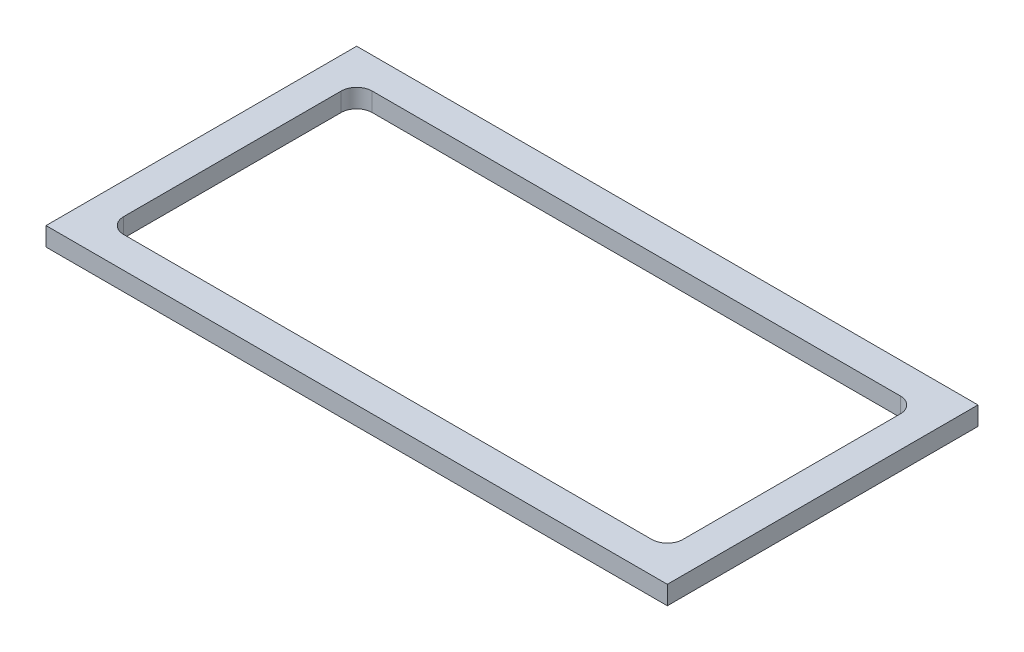
ISO-10303-21;
HEADER;
FILE_DESCRIPTION(('STEP AP214'),'2;1');
FILE_NAME('part.step','',(''),(''),'','','');
FILE_SCHEMA(('AUTOMOTIVE_DESIGN { 1 0 10303 214 1 1 1 1 }'));
ENDSEC;
DATA;
#1=APPLICATION_CONTEXT('core data for automotive mechanical design processes');
#2=APPLICATION_PROTOCOL_DEFINITION('international standard','automotive_design',2000,#1);
#3=PRODUCT_CONTEXT('',#1,'mechanical');
#4=PRODUCT('Part','Part','',(#3));
#5=PRODUCT_RELATED_PRODUCT_CATEGORY('part','',(#4));
#6=PRODUCT_DEFINITION_FORMATION('','',#4);
#7=PRODUCT_DEFINITION_CONTEXT('part definition',#1,'design');
#8=PRODUCT_DEFINITION('design','',#6,#7);
#9=PRODUCT_DEFINITION_SHAPE('','',#8);
#10=(LENGTH_UNIT() NAMED_UNIT(*) SI_UNIT(.MILLI.,.METRE.));
#11=(NAMED_UNIT(*) PLANE_ANGLE_UNIT() SI_UNIT($,.RADIAN.));
#12=(NAMED_UNIT(*) SI_UNIT($,.STERADIAN.) SOLID_ANGLE_UNIT());
#13=UNCERTAINTY_MEASURE_WITH_UNIT(LENGTH_MEASURE(1.E-05),#10,'distance_accuracy_value','');
#14=(GEOMETRIC_REPRESENTATION_CONTEXT(3) GLOBAL_UNCERTAINTY_ASSIGNED_CONTEXT((#13)) GLOBAL_UNIT_ASSIGNED_CONTEXT((#10,
#11,#12)) REPRESENTATION_CONTEXT('',''));
#15=CARTESIAN_POINT('',(0.,0.,0.));
#16=DIRECTION('',(0.,0.,1.));
#17=DIRECTION('',(1.,0.,0.));
#18=AXIS2_PLACEMENT_3D('',#15,#16,#17);
#19=CARTESIAN_POINT('',(0.,6.,0.));
#20=DIRECTION('',(1.,0.,0.));
#21=DIRECTION('',(0.,0.,-1.));
#22=AXIS2_PLACEMENT_3D('',#19,#20,#21);
#23=PLANE('',#22);
#24=DIRECTION('',(0.,0.,1.));
#25=VECTOR('',#24,1.);
#26=CARTESIAN_POINT('',(0.,0.,0.));
#27=LINE('',#26,#25);
#28=CARTESIAN_POINT('',(0.,0.,-100.));
#29=VERTEX_POINT('',#28);
#30=CARTESIAN_POINT('',(0.,0.,0.));
#31=VERTEX_POINT('',#30);
#32=EDGE_CURVE('E145',#29,#31,#27,.T.);
#33=ORIENTED_EDGE('',*,*,#32,.T.);
#34=DIRECTION('',(0.,-1.,0.));
#35=VECTOR('',#34,1.);
#36=CARTESIAN_POINT('',(0.,6.,0.));
#37=LINE('',#36,#35);
#38=CARTESIAN_POINT('',(0.,6.,0.));
#39=VERTEX_POINT('',#38);
#40=EDGE_CURVE('E126',#39,#31,#37,.T.);
#41=ORIENTED_EDGE('',*,*,#40,.F.);
#42=DIRECTION('',(0.,0.,1.));
#43=VECTOR('',#42,1.);
#44=CARTESIAN_POINT('',(0.,6.,0.));
#45=LINE('',#44,#43);
#46=CARTESIAN_POINT('',(0.,6.,-100.));
#47=VERTEX_POINT('',#46);
#48=EDGE_CURVE('E133',#47,#39,#45,.T.);
#49=ORIENTED_EDGE('',*,*,#48,.F.);
#50=DIRECTION('',(0.,-1.,0.));
#51=VECTOR('',#50,1.);
#52=CARTESIAN_POINT('',(0.,6.,-100.));
#53=LINE('',#52,#51);
#54=EDGE_CURVE('E220',#47,#29,#53,.T.);
#55=ORIENTED_EDGE('',*,*,#54,.T.);
#56=EDGE_LOOP('',(#33,#41,#49,#55));
#57=FACE_BOUND('',#56,.T.);
#58=ADVANCED_FACE('F32',(#57),#23,.F.);
#59=CARTESIAN_POINT('',(0.,6.,0.));
#60=DIRECTION('',(0.,0.,-1.));
#61=DIRECTION('',(-1.,0.,0.));
#62=AXIS2_PLACEMENT_3D('',#59,#60,#61);
#63=PLANE('',#62);
#64=DIRECTION('',(1.,0.,0.));
#65=VECTOR('',#64,1.);
#66=CARTESIAN_POINT('',(0.,0.,0.));
#67=LINE('',#66,#65);
#68=CARTESIAN_POINT('',(200.,0.,0.));
#69=VERTEX_POINT('',#68);
#70=EDGE_CURVE('E222',#31,#69,#67,.T.);
#71=ORIENTED_EDGE('',*,*,#70,.T.);
#72=DIRECTION('',(0.,-1.,0.));
#73=VECTOR('',#72,1.);
#74=CARTESIAN_POINT('',(200.,6.,0.));
#75=LINE('',#74,#73);
#76=CARTESIAN_POINT('',(200.,6.,0.));
#77=VERTEX_POINT('',#76);
#78=EDGE_CURVE('E129',#77,#69,#75,.T.);
#79=ORIENTED_EDGE('',*,*,#78,.F.);
#80=DIRECTION('',(1.,0.,0.));
#81=VECTOR('',#80,1.);
#82=CARTESIAN_POINT('',(0.,6.,0.));
#83=LINE('',#82,#81);
#84=EDGE_CURVE('E122',#39,#77,#83,.T.);
#85=ORIENTED_EDGE('',*,*,#84,.F.);
#86=ORIENTED_EDGE('',*,*,#40,.T.);
#87=EDGE_LOOP('',(#71,#79,#85,#86));
#88=FACE_BOUND('',#87,.T.);
#89=ADVANCED_FACE('F124',(#88),#63,.F.);
#90=CARTESIAN_POINT('',(200.,6.,0.));
#91=DIRECTION('',(-1.,0.,0.));
#92=DIRECTION('',(0.,0.,1.));
#93=AXIS2_PLACEMENT_3D('',#90,#91,#92);
#94=PLANE('',#93);
#95=DIRECTION('',(0.,0.,-1.));
#96=VECTOR('',#95,1.);
#97=CARTESIAN_POINT('',(200.,0.,0.));
#98=LINE('',#97,#96);
#99=CARTESIAN_POINT('',(200.,0.,-100.));
#100=VERTEX_POINT('',#99);
#101=EDGE_CURVE('E224',#69,#100,#98,.T.);
#102=ORIENTED_EDGE('',*,*,#101,.T.);
#103=DIRECTION('',(0.,-1.,0.));
#104=VECTOR('',#103,1.);
#105=CARTESIAN_POINT('',(200.,6.,-100.));
#106=LINE('',#105,#104);
#107=CARTESIAN_POINT('',(200.,6.,-100.));
#108=VERTEX_POINT('',#107);
#109=EDGE_CURVE('E150',#108,#100,#106,.T.);
#110=ORIENTED_EDGE('',*,*,#109,.F.);
#111=DIRECTION('',(0.,0.,-1.));
#112=VECTOR('',#111,1.);
#113=CARTESIAN_POINT('',(200.,6.,0.));
#114=LINE('',#113,#112);
#115=EDGE_CURVE('E132',#77,#108,#114,.T.);
#116=ORIENTED_EDGE('',*,*,#115,.F.);
#117=ORIENTED_EDGE('',*,*,#78,.T.);
#118=EDGE_LOOP('',(#102,#110,#116,#117));
#119=FACE_BOUND('',#118,.T.);
#120=ADVANCED_FACE('F234',(#119),#94,.F.);
#121=CARTESIAN_POINT('',(0.,6.,-100.));
#122=DIRECTION('',(0.,0.,1.));
#123=DIRECTION('',(1.,0.,0.));
#124=AXIS2_PLACEMENT_3D('',#121,#122,#123);
#125=PLANE('',#124);
#126=DIRECTION('',(-1.,0.,0.));
#127=VECTOR('',#126,1.);
#128=CARTESIAN_POINT('',(0.,0.,-100.));
#129=LINE('',#128,#127);
#130=EDGE_CURVE('E142',#100,#29,#129,.T.);
#131=ORIENTED_EDGE('',*,*,#130,.T.);
#132=ORIENTED_EDGE('',*,*,#54,.F.);
#133=DIRECTION('',(-1.,0.,0.));
#134=VECTOR('',#133,1.);
#135=CARTESIAN_POINT('',(0.,6.,-100.));
#136=LINE('',#135,#134);
#137=EDGE_CURVE('E138',#108,#47,#136,.T.);
#138=ORIENTED_EDGE('',*,*,#137,.F.);
#139=ORIENTED_EDGE('',*,*,#109,.T.);
#140=EDGE_LOOP('',(#131,#132,#138,#139));
#141=FACE_BOUND('',#140,.T.);
#142=ADVANCED_FACE('F231',(#141),#125,.F.);
#143=CARTESIAN_POINT('',(0.,6.,0.));
#144=DIRECTION('',(0.,-1.,0.));
#145=DIRECTION('',(0.,0.,-1.));
#146=AXIS2_PLACEMENT_3D('',#143,#144,#145);
#147=PLANE('',#146);
#148=DIRECTION('',(1.,0.,0.));
#149=VECTOR('',#148,1.);
#150=CARTESIAN_POINT('',(10.,6.,-10.));
#151=LINE('',#150,#149);
#152=CARTESIAN_POINT('',(15.,6.,-10.));
#153=VERTEX_POINT('',#152);
#154=CARTESIAN_POINT('',(185.,6.,-10.));
#155=VERTEX_POINT('',#154);
#156=EDGE_CURVE('E213',#153,#155,#151,.T.);
#157=ORIENTED_EDGE('',*,*,#156,.F.);
#158=CARTESIAN_POINT('',(15.,6.,-15.));
#159=DIRECTION('',(0.,-1.,0.));
#160=DIRECTION('',(0.,0.,-1.));
#161=AXIS2_PLACEMENT_3D('',#158,#159,#160);
#162=CIRCLE('',#161,5.);
#163=CARTESIAN_POINT('',(10.,6.,-15.));
#164=VERTEX_POINT('',#163);
#165=EDGE_CURVE('E170',#153,#164,#162,.T.);
#166=ORIENTED_EDGE('',*,*,#165,.T.);
#167=DIRECTION('',(0.,0.,1.));
#168=VECTOR('',#167,1.);
#169=CARTESIAN_POINT('',(10.,6.,-90.));
#170=LINE('',#169,#168);
#171=CARTESIAN_POINT('',(10.,6.,-85.));
#172=VERTEX_POINT('',#171);
#173=EDGE_CURVE('E186',#172,#164,#170,.T.);
#174=ORIENTED_EDGE('',*,*,#173,.F.);
#175=CARTESIAN_POINT('',(15.,6.,-85.));
#176=DIRECTION('',(0.,-1.,0.));
#177=DIRECTION('',(0.,0.,-1.));
#178=AXIS2_PLACEMENT_3D('',#175,#176,#177);
#179=CIRCLE('',#178,5.);
#180=CARTESIAN_POINT('',(15.,6.,-90.));
#181=VERTEX_POINT('',#180);
#182=EDGE_CURVE('E40',#172,#181,#179,.T.);
#183=ORIENTED_EDGE('',*,*,#182,.T.);
#184=DIRECTION('',(-1.,0.,0.));
#185=VECTOR('',#184,1.);
#186=CARTESIAN_POINT('',(10.,6.,-90.));
#187=LINE('',#186,#185);
#188=CARTESIAN_POINT('',(185.,6.,-90.));
#189=VERTEX_POINT('',#188);
#190=EDGE_CURVE('E184',#189,#181,#187,.T.);
#191=ORIENTED_EDGE('',*,*,#190,.F.);
#192=CARTESIAN_POINT('',(185.,6.,-85.));
#193=DIRECTION('',(0.,-1.,0.));
#194=DIRECTION('',(0.,0.,-1.));
#195=AXIS2_PLACEMENT_3D('',#192,#193,#194);
#196=CIRCLE('',#195,5.);
#197=CARTESIAN_POINT('',(190.,6.,-85.));
#198=VERTEX_POINT('',#197);
#199=EDGE_CURVE('E178',#189,#198,#196,.T.);
#200=ORIENTED_EDGE('',*,*,#199,.T.);
#201=DIRECTION('',(0.,0.,-1.));
#202=VECTOR('',#201,1.);
#203=CARTESIAN_POINT('',(190.,6.,-90.));
#204=LINE('',#203,#202);
#205=CARTESIAN_POINT('',(190.,6.,-15.));
#206=VERTEX_POINT('',#205);
#207=EDGE_CURVE('E192',#206,#198,#204,.T.);
#208=ORIENTED_EDGE('',*,*,#207,.F.);
#209=CARTESIAN_POINT('',(185.,6.,-15.));
#210=DIRECTION('',(0.,-1.,0.));
#211=DIRECTION('',(0.,0.,-1.));
#212=AXIS2_PLACEMENT_3D('',#209,#210,#211);
#213=CIRCLE('',#212,5.);
#214=EDGE_CURVE('E174',#206,#155,#213,.T.);
#215=ORIENTED_EDGE('',*,*,#214,.T.);
#216=EDGE_LOOP('',(#157,#166,#174,#183,#191,#200,#208,#215));
#217=FACE_BOUND('',#216,.T.);
#218=ORIENTED_EDGE('',*,*,#48,.T.);
#219=ORIENTED_EDGE('',*,*,#84,.T.);
#220=ORIENTED_EDGE('',*,*,#115,.T.);
#221=ORIENTED_EDGE('',*,*,#137,.T.);
#222=EDGE_LOOP('',(#218,#219,#220,#221));
#223=FACE_BOUND('',#222,.T.);
#224=ADVANCED_FACE('F136',(#217,#223),#147,.F.);
#225=CARTESIAN_POINT('',(0.,0.,0.));
#226=DIRECTION('',(0.,-1.,0.));
#227=DIRECTION('',(0.,0.,-1.));
#228=AXIS2_PLACEMENT_3D('',#225,#226,#227);
#229=PLANE('',#228);
#230=DIRECTION('',(-1.,0.,0.));
#231=VECTOR('',#230,1.);
#232=CARTESIAN_POINT('',(10.,0.,-90.));
#233=LINE('',#232,#231);
#234=CARTESIAN_POINT('',(185.,0.,-90.));
#235=VERTEX_POINT('',#234);
#236=CARTESIAN_POINT('',(15.,0.,-90.));
#237=VERTEX_POINT('',#236);
#238=EDGE_CURVE('E200',#235,#237,#233,.T.);
#239=ORIENTED_EDGE('',*,*,#238,.T.);
#240=CARTESIAN_POINT('',(15.,0.,-85.));
#241=DIRECTION('',(0.,-1.,0.));
#242=DIRECTION('',(0.,0.,-1.));
#243=AXIS2_PLACEMENT_3D('',#240,#241,#242);
#244=CIRCLE('',#243,5.);
#245=CARTESIAN_POINT('',(10.,0.,-85.));
#246=VERTEX_POINT('',#245);
#247=EDGE_CURVE('E11',#237,#246,#244,.F.);
#248=ORIENTED_EDGE('',*,*,#247,.T.);
#249=DIRECTION('',(0.,0.,1.));
#250=VECTOR('',#249,1.);
#251=CARTESIAN_POINT('',(10.,0.,-90.));
#252=LINE('',#251,#250);
#253=CARTESIAN_POINT('',(10.,0.,-15.));
#254=VERTEX_POINT('',#253);
#255=EDGE_CURVE('E191',#246,#254,#252,.T.);
#256=ORIENTED_EDGE('',*,*,#255,.T.);
#257=CARTESIAN_POINT('',(15.,0.,-15.));
#258=DIRECTION('',(0.,-1.,0.));
#259=DIRECTION('',(0.,0.,-1.));
#260=AXIS2_PLACEMENT_3D('',#257,#258,#259);
#261=CIRCLE('',#260,5.);
#262=CARTESIAN_POINT('',(15.,0.,-10.));
#263=VERTEX_POINT('',#262);
#264=EDGE_CURVE('E172',#254,#263,#261,.F.);
#265=ORIENTED_EDGE('',*,*,#264,.T.);
#266=DIRECTION('',(1.,0.,0.));
#267=VECTOR('',#266,1.);
#268=CARTESIAN_POINT('',(10.,0.,-10.));
#269=LINE('',#268,#267);
#270=CARTESIAN_POINT('',(185.,0.,-10.));
#271=VERTEX_POINT('',#270);
#272=EDGE_CURVE('E204',#263,#271,#269,.T.);
#273=ORIENTED_EDGE('',*,*,#272,.T.);
#274=CARTESIAN_POINT('',(185.,0.,-15.));
#275=DIRECTION('',(0.,-1.,0.));
#276=DIRECTION('',(0.,0.,-1.));
#277=AXIS2_PLACEMENT_3D('',#274,#275,#276);
#278=CIRCLE('',#277,5.);
#279=CARTESIAN_POINT('',(190.,0.,-15.));
#280=VERTEX_POINT('',#279);
#281=EDGE_CURVE('E176',#271,#280,#278,.F.);
#282=ORIENTED_EDGE('',*,*,#281,.T.);
#283=DIRECTION('',(0.,0.,-1.));
#284=VECTOR('',#283,1.);
#285=CARTESIAN_POINT('',(190.,0.,-90.));
#286=LINE('',#285,#284);
#287=CARTESIAN_POINT('',(190.,0.,-85.));
#288=VERTEX_POINT('',#287);
#289=EDGE_CURVE('E207',#280,#288,#286,.T.);
#290=ORIENTED_EDGE('',*,*,#289,.T.);
#291=CARTESIAN_POINT('',(185.,0.,-85.));
#292=DIRECTION('',(0.,-1.,0.));
#293=DIRECTION('',(0.,0.,-1.));
#294=AXIS2_PLACEMENT_3D('',#291,#292,#293);
#295=CIRCLE('',#294,5.);
#296=EDGE_CURVE('E54',#288,#235,#295,.F.);
#297=ORIENTED_EDGE('',*,*,#296,.T.);
#298=EDGE_LOOP('',(#239,#248,#256,#265,#273,#282,#290,#297));
#299=FACE_BOUND('',#298,.T.);
#300=ORIENTED_EDGE('',*,*,#32,.F.);
#301=ORIENTED_EDGE('',*,*,#130,.F.);
#302=ORIENTED_EDGE('',*,*,#101,.F.);
#303=ORIENTED_EDGE('',*,*,#70,.F.);
#304=EDGE_LOOP('',(#300,#301,#302,#303));
#305=FACE_BOUND('',#304,.T.);
#306=ADVANCED_FACE('F197',(#299,#305),#229,.T.);
#307=CARTESIAN_POINT('',(10.,0.,-90.));
#308=DIRECTION('',(-1.,0.,0.));
#309=DIRECTION('',(0.,0.,1.));
#310=AXIS2_PLACEMENT_3D('',#307,#308,#309);
#311=PLANE('',#310);
#312=ORIENTED_EDGE('',*,*,#173,.T.);
#313=DIRECTION('',(0.,1.,0.));
#314=VECTOR('',#313,1.);
#315=CARTESIAN_POINT('',(10.,0.,-15.));
#316=LINE('',#315,#314);
#317=EDGE_CURVE('E159',#164,#254,#316,.F.);
#318=ORIENTED_EDGE('',*,*,#317,.T.);
#319=ORIENTED_EDGE('',*,*,#255,.F.);
#320=DIRECTION('',(0.,1.,0.));
#321=VECTOR('',#320,1.);
#322=CARTESIAN_POINT('',(10.,6.,-85.));
#323=LINE('',#322,#321);
#324=EDGE_CURVE('E156',#246,#172,#323,.T.);
#325=ORIENTED_EDGE('',*,*,#324,.T.);
#326=EDGE_LOOP('',(#312,#318,#319,#325));
#327=FACE_BOUND('',#326,.T.);
#328=ADVANCED_FACE('F202',(#327),#311,.F.);
#329=CARTESIAN_POINT('',(10.,0.,-90.));
#330=DIRECTION('',(0.,0.,-1.));
#331=DIRECTION('',(-1.,0.,0.));
#332=AXIS2_PLACEMENT_3D('',#329,#330,#331);
#333=PLANE('',#332);
#334=ORIENTED_EDGE('',*,*,#238,.F.);
#335=DIRECTION('',(0.,1.,0.));
#336=VECTOR('',#335,1.);
#337=CARTESIAN_POINT('',(185.,6.,-90.));
#338=LINE('',#337,#336);
#339=EDGE_CURVE('E167',#235,#189,#338,.T.);
#340=ORIENTED_EDGE('',*,*,#339,.T.);
#341=ORIENTED_EDGE('',*,*,#190,.T.);
#342=DIRECTION('',(0.,1.,0.));
#343=VECTOR('',#342,1.);
#344=CARTESIAN_POINT('',(15.,0.,-90.));
#345=LINE('',#344,#343);
#346=EDGE_CURVE('E47',#181,#237,#345,.F.);
#347=ORIENTED_EDGE('',*,*,#346,.T.);
#348=EDGE_LOOP('',(#334,#340,#341,#347));
#349=FACE_BOUND('',#348,.T.);
#350=ADVANCED_FACE('F189',(#349),#333,.F.);
#351=CARTESIAN_POINT('',(190.,0.,-90.));
#352=DIRECTION('',(1.,0.,0.));
#353=DIRECTION('',(0.,0.,-1.));
#354=AXIS2_PLACEMENT_3D('',#351,#352,#353);
#355=PLANE('',#354);
#356=ORIENTED_EDGE('',*,*,#289,.F.);
#357=DIRECTION('',(0.,1.,0.));
#358=VECTOR('',#357,1.);
#359=CARTESIAN_POINT('',(190.,6.,-15.));
#360=LINE('',#359,#358);
#361=EDGE_CURVE('E163',#280,#206,#360,.T.);
#362=ORIENTED_EDGE('',*,*,#361,.T.);
#363=ORIENTED_EDGE('',*,*,#207,.T.);
#364=DIRECTION('',(0.,1.,0.));
#365=VECTOR('',#364,1.);
#366=CARTESIAN_POINT('',(190.,0.,-85.));
#367=LINE('',#366,#365);
#368=EDGE_CURVE('E161',#198,#288,#367,.F.);
#369=ORIENTED_EDGE('',*,*,#368,.T.);
#370=EDGE_LOOP('',(#356,#362,#363,#369));
#371=FACE_BOUND('',#370,.T.);
#372=ADVANCED_FACE('F266',(#371),#355,.F.);
#373=CARTESIAN_POINT('',(10.,0.,-10.));
#374=DIRECTION('',(0.,0.,1.));
#375=DIRECTION('',(1.,0.,0.));
#376=AXIS2_PLACEMENT_3D('',#373,#374,#375);
#377=PLANE('',#376);
#378=ORIENTED_EDGE('',*,*,#272,.F.);
#379=DIRECTION('',(0.,1.,0.));
#380=VECTOR('',#379,1.);
#381=CARTESIAN_POINT('',(15.,6.,-10.));
#382=LINE('',#381,#380);
#383=EDGE_CURVE('E148',#263,#153,#382,.T.);
#384=ORIENTED_EDGE('',*,*,#383,.T.);
#385=ORIENTED_EDGE('',*,*,#156,.T.);
#386=DIRECTION('',(0.,1.,0.));
#387=VECTOR('',#386,1.);
#388=CARTESIAN_POINT('',(185.,0.,-10.));
#389=LINE('',#388,#387);
#390=EDGE_CURVE('E146',#155,#271,#389,.F.);
#391=ORIENTED_EDGE('',*,*,#390,.T.);
#392=EDGE_LOOP('',(#378,#384,#385,#391));
#393=FACE_BOUND('',#392,.T.);
#394=ADVANCED_FACE('F252',(#393),#377,.F.);
#395=CARTESIAN_POINT('',(15.,0.,-15.));
#396=DIRECTION('',(0.,-1.,0.));
#397=DIRECTION('',(0.,0.,-1.));
#398=AXIS2_PLACEMENT_3D('',#395,#396,#397);
#399=CYLINDRICAL_SURFACE('',#398,5.);
#400=ORIENTED_EDGE('',*,*,#264,.F.);
#401=ORIENTED_EDGE('',*,*,#317,.F.);
#402=ORIENTED_EDGE('',*,*,#165,.F.);
#403=ORIENTED_EDGE('',*,*,#383,.F.);
#404=EDGE_LOOP('',(#400,#401,#402,#403));
#405=FACE_BOUND('',#404,.T.);
#406=ADVANCED_FACE('F248',(#405),#399,.F.);
#407=CARTESIAN_POINT('',(185.,0.,-15.));
#408=DIRECTION('',(0.,-1.,0.));
#409=DIRECTION('',(0.,0.,-1.));
#410=AXIS2_PLACEMENT_3D('',#407,#408,#409);
#411=CYLINDRICAL_SURFACE('',#410,5.);
#412=ORIENTED_EDGE('',*,*,#281,.F.);
#413=ORIENTED_EDGE('',*,*,#390,.F.);
#414=ORIENTED_EDGE('',*,*,#214,.F.);
#415=ORIENTED_EDGE('',*,*,#361,.F.);
#416=EDGE_LOOP('',(#412,#413,#414,#415));
#417=FACE_BOUND('',#416,.T.);
#418=ADVANCED_FACE('F251',(#417),#411,.F.);
#419=CARTESIAN_POINT('',(185.,0.,-85.));
#420=DIRECTION('',(0.,-1.,0.));
#421=DIRECTION('',(0.,0.,-1.));
#422=AXIS2_PLACEMENT_3D('',#419,#420,#421);
#423=CYLINDRICAL_SURFACE('',#422,5.);
#424=ORIENTED_EDGE('',*,*,#296,.F.);
#425=ORIENTED_EDGE('',*,*,#368,.F.);
#426=ORIENTED_EDGE('',*,*,#199,.F.);
#427=ORIENTED_EDGE('',*,*,#339,.F.);
#428=EDGE_LOOP('',(#424,#425,#426,#427));
#429=FACE_BOUND('',#428,.T.);
#430=ADVANCED_FACE('F255',(#429),#423,.F.);
#431=CARTESIAN_POINT('',(15.,0.,-85.));
#432=DIRECTION('',(0.,-1.,0.));
#433=DIRECTION('',(0.,0.,-1.));
#434=AXIS2_PLACEMENT_3D('',#431,#432,#433);
#435=CYLINDRICAL_SURFACE('',#434,5.);
#436=ORIENTED_EDGE('',*,*,#247,.F.);
#437=ORIENTED_EDGE('',*,*,#346,.F.);
#438=ORIENTED_EDGE('',*,*,#182,.F.);
#439=ORIENTED_EDGE('',*,*,#324,.F.);
#440=EDGE_LOOP('',(#436,#437,#438,#439));
#441=FACE_BOUND('',#440,.T.);
#442=ADVANCED_FACE('F34',(#441),#435,.F.);
#443=CLOSED_SHELL('',(#58,#89,#120,#142,#224,#306,#328,#350,#372,#394,#406,#418,#430,#442));
#444=MANIFOLD_SOLID_BREP('B2',#443);
#445=ADVANCED_BREP_SHAPE_REPRESENTATION('',(#18,#444),#14);
#446=SHAPE_DEFINITION_REPRESENTATION(#9,#445);
ENDSEC;
END-ISO-10303-21;
